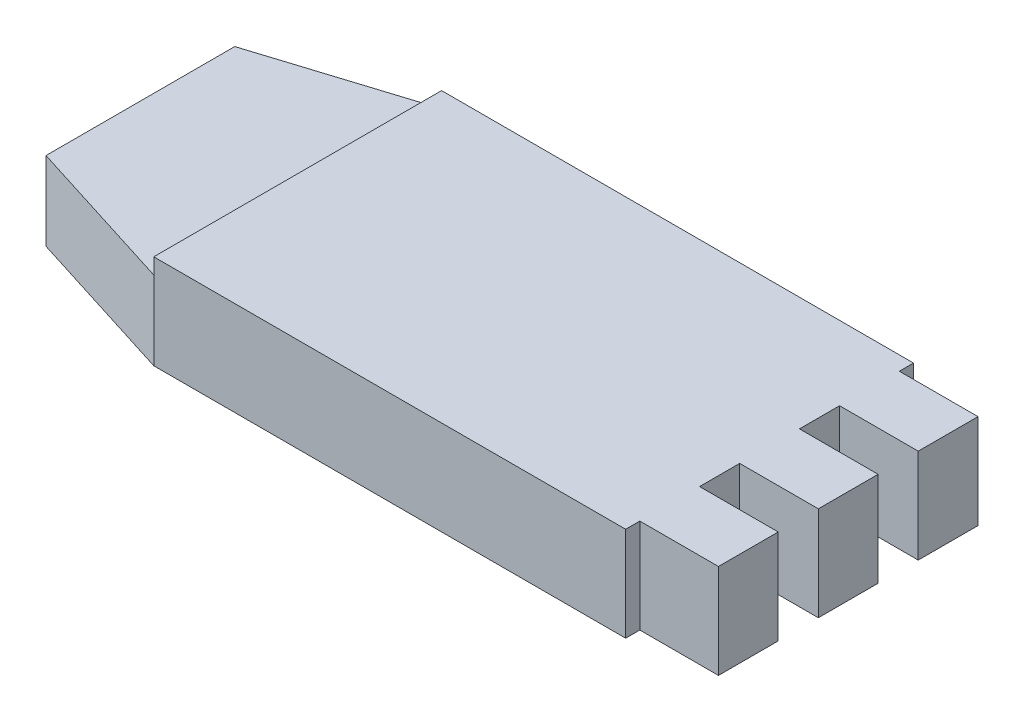
ISO-10303-21;
HEADER;
FILE_DESCRIPTION(('STEP AP214'),'2;1');
FILE_NAME('part.step','',(''),(''),'','','');
FILE_SCHEMA(('AUTOMOTIVE_DESIGN { 1 0 10303 214 1 1 1 1 }'));
ENDSEC;
DATA;
#1=APPLICATION_CONTEXT('core data for automotive mechanical design processes');
#2=APPLICATION_PROTOCOL_DEFINITION('international standard','automotive_design',2000,#1);
#3=PRODUCT_CONTEXT('',#1,'mechanical');
#4=PRODUCT('Part','Part','',(#3));
#5=PRODUCT_RELATED_PRODUCT_CATEGORY('part','',(#4));
#6=PRODUCT_DEFINITION_FORMATION('','',#4);
#7=PRODUCT_DEFINITION_CONTEXT('part definition',#1,'design');
#8=PRODUCT_DEFINITION('design','',#6,#7);
#9=PRODUCT_DEFINITION_SHAPE('','',#8);
#10=(LENGTH_UNIT() NAMED_UNIT(*) SI_UNIT(.MILLI.,.METRE.));
#11=(NAMED_UNIT(*) PLANE_ANGLE_UNIT() SI_UNIT($,.RADIAN.));
#12=(NAMED_UNIT(*) SI_UNIT($,.STERADIAN.) SOLID_ANGLE_UNIT());
#13=UNCERTAINTY_MEASURE_WITH_UNIT(LENGTH_MEASURE(1.E-05),#10,'distance_accuracy_value','');
#14=(GEOMETRIC_REPRESENTATION_CONTEXT(3) GLOBAL_UNCERTAINTY_ASSIGNED_CONTEXT((#13)) GLOBAL_UNIT_ASSIGNED_CONTEXT((#10,
#11,#12)) REPRESENTATION_CONTEXT('',''));
#15=CARTESIAN_POINT('',(0.,0.,0.));
#16=DIRECTION('',(0.,0.,1.));
#17=DIRECTION('',(1.,0.,0.));
#18=AXIS2_PLACEMENT_3D('',#15,#16,#17);
#19=CARTESIAN_POINT('',(-17.5,6.,0.));
#20=DIRECTION('',(-1.,0.,0.));
#21=DIRECTION('',(0.,0.,1.));
#22=AXIS2_PLACEMENT_3D('',#19,#20,#21);
#23=PLANE('',#22);
#24=DIRECTION('',(0.,-1.,0.));
#25=VECTOR('',#24,1.);
#26=CARTESIAN_POINT('',(-17.5,6.,-9.15));
#27=LINE('',#26,#25);
#28=CARTESIAN_POINT('',(-17.5,6.,-9.15));
#29=VERTEX_POINT('',#28);
#30=CARTESIAN_POINT('',(-17.5,5.,-9.15));
#31=VERTEX_POINT('',#30);
#32=EDGE_CURVE('E278',#29,#31,#27,.T.);
#33=ORIENTED_EDGE('',*,*,#32,.T.);
#34=DIRECTION('',(0.,0.,1.));
#35=VECTOR('',#34,1.);
#36=CARTESIAN_POINT('',(-17.5,5.,0.));
#37=LINE('',#36,#35);
#38=CARTESIAN_POINT('',(-17.5,5.,9.15));
#39=VERTEX_POINT('',#38);
#40=EDGE_CURVE('E666',#31,#39,#37,.T.);
#41=ORIENTED_EDGE('',*,*,#40,.T.);
#42=DIRECTION('',(0.,-1.,0.));
#43=VECTOR('',#42,1.);
#44=CARTESIAN_POINT('',(-17.5,6.,9.15));
#45=LINE('',#44,#43);
#46=CARTESIAN_POINT('',(-17.5,6.,9.15));
#47=VERTEX_POINT('',#46);
#48=EDGE_CURVE('E274',#47,#39,#45,.T.);
#49=ORIENTED_EDGE('',*,*,#48,.F.);
#50=DIRECTION('',(0.,0.,-1.));
#51=VECTOR('',#50,1.);
#52=CARTESIAN_POINT('',(-17.5,6.,0.));
#53=LINE('',#52,#51);
#54=EDGE_CURVE('E326',#47,#29,#53,.T.);
#55=ORIENTED_EDGE('',*,*,#54,.T.);
#56=EDGE_LOOP('',(#33,#41,#49,#55));
#57=FACE_BOUND('',#56,.T.);
#58=ADVANCED_FACE('F47',(#57),#23,.T.);
#59=CARTESIAN_POINT('',(12.5,6.,0.));
#60=DIRECTION('',(1.,0.,0.));
#61=DIRECTION('',(0.,0.,-1.));
#62=AXIS2_PLACEMENT_3D('',#59,#60,#61);
#63=PLANE('',#62);
#64=DIRECTION('',(0.,0.,1.));
#65=VECTOR('',#64,1.);
#66=CARTESIAN_POINT('',(12.5,0.,0.));
#67=LINE('',#66,#65);
#68=CARTESIAN_POINT('',(12.5,0.,-4.45));
#69=VERTEX_POINT('',#68);
#70=CARTESIAN_POINT('',(12.5,0.,-1.9));
#71=VERTEX_POINT('',#70);
#72=EDGE_CURVE('E202',#69,#71,#67,.T.);
#73=ORIENTED_EDGE('',*,*,#72,.F.);
#74=DIRECTION('',(0.,-1.,0.));
#75=VECTOR('',#74,1.);
#76=CARTESIAN_POINT('',(12.5,6.,-4.45));
#77=LINE('',#76,#75);
#78=CARTESIAN_POINT('',(12.5,6.,-4.45));
#79=VERTEX_POINT('',#78);
#80=EDGE_CURVE('E11',#79,#69,#77,.T.);
#81=ORIENTED_EDGE('',*,*,#80,.F.);
#82=DIRECTION('',(0.,0.,1.));
#83=VECTOR('',#82,1.);
#84=CARTESIAN_POINT('',(12.5,6.,0.));
#85=LINE('',#84,#83);
#86=CARTESIAN_POINT('',(12.5,6.,-1.9));
#87=VERTEX_POINT('',#86);
#88=EDGE_CURVE('E251',#79,#87,#85,.T.);
#89=ORIENTED_EDGE('',*,*,#88,.T.);
#90=DIRECTION('',(0.,-1.,0.));
#91=VECTOR('',#90,1.);
#92=CARTESIAN_POINT('',(12.5,6.,-1.9));
#93=LINE('',#92,#91);
#94=EDGE_CURVE('E72',#87,#71,#93,.T.);
#95=ORIENTED_EDGE('',*,*,#94,.T.);
#96=EDGE_LOOP('',(#73,#81,#89,#95));
#97=FACE_BOUND('',#96,.T.);
#98=ADVANCED_FACE('F352',(#97),#63,.T.);
#99=CARTESIAN_POINT('',(0.,6.,-4.45));
#100=DIRECTION('',(0.,0.,-1.));
#101=DIRECTION('',(-1.,0.,0.));
#102=AXIS2_PLACEMENT_3D('',#99,#100,#101);
#103=PLANE('',#102);
#104=DIRECTION('',(1.,0.,0.));
#105=VECTOR('',#104,1.);
#106=CARTESIAN_POINT('',(0.,0.,-4.45));
#107=LINE('',#106,#105);
#108=CARTESIAN_POINT('',(17.5,0.,-4.45));
#109=VERTEX_POINT('',#108);
#110=EDGE_CURVE('E205',#69,#109,#107,.T.);
#111=ORIENTED_EDGE('',*,*,#110,.T.);
#112=DIRECTION('',(0.,-1.,0.));
#113=VECTOR('',#112,1.);
#114=CARTESIAN_POINT('',(17.5,6.,-4.45));
#115=LINE('',#114,#113);
#116=CARTESIAN_POINT('',(17.5,6.,-4.45));
#117=VERTEX_POINT('',#116);
#118=EDGE_CURVE('E56',#117,#109,#115,.T.);
#119=ORIENTED_EDGE('',*,*,#118,.F.);
#120=DIRECTION('',(1.,0.,0.));
#121=VECTOR('',#120,1.);
#122=CARTESIAN_POINT('',(0.,6.,-4.45));
#123=LINE('',#122,#121);
#124=EDGE_CURVE('E319',#79,#117,#123,.T.);
#125=ORIENTED_EDGE('',*,*,#124,.F.);
#126=ORIENTED_EDGE('',*,*,#80,.T.);
#127=EDGE_LOOP('',(#111,#119,#125,#126));
#128=FACE_BOUND('',#127,.T.);
#129=ADVANCED_FACE('F49',(#128),#103,.F.);
#130=CARTESIAN_POINT('',(17.5,6.,0.));
#131=DIRECTION('',(-1.,0.,0.));
#132=DIRECTION('',(0.,0.,1.));
#133=AXIS2_PLACEMENT_3D('',#130,#131,#132);
#134=PLANE('',#133);
#135=DIRECTION('',(0.,0.,-1.));
#136=VECTOR('',#135,1.);
#137=CARTESIAN_POINT('',(17.5,0.,0.));
#138=LINE('',#137,#136);
#139=CARTESIAN_POINT('',(17.5,0.,-8.25));
#140=VERTEX_POINT('',#139);
#141=EDGE_CURVE('E211',#109,#140,#138,.T.);
#142=ORIENTED_EDGE('',*,*,#141,.T.);
#143=DIRECTION('',(0.,-1.,0.));
#144=VECTOR('',#143,1.);
#145=CARTESIAN_POINT('',(17.5,6.,-8.25));
#146=LINE('',#145,#144);
#147=CARTESIAN_POINT('',(17.5,6.,-8.25));
#148=VERTEX_POINT('',#147);
#149=EDGE_CURVE('E288',#148,#140,#146,.T.);
#150=ORIENTED_EDGE('',*,*,#149,.F.);
#151=DIRECTION('',(0.,0.,-1.));
#152=VECTOR('',#151,1.);
#153=CARTESIAN_POINT('',(17.5,6.,0.));
#154=LINE('',#153,#152);
#155=EDGE_CURVE('E298',#117,#148,#154,.T.);
#156=ORIENTED_EDGE('',*,*,#155,.F.);
#157=ORIENTED_EDGE('',*,*,#118,.T.);
#158=EDGE_LOOP('',(#142,#150,#156,#157));
#159=FACE_BOUND('',#158,.T.);
#160=ADVANCED_FACE('F296',(#159),#134,.F.);
#161=CARTESIAN_POINT('',(0.,6.,-8.25));
#162=DIRECTION('',(0.,0.,-1.));
#163=DIRECTION('',(-1.,0.,0.));
#164=AXIS2_PLACEMENT_3D('',#161,#162,#163);
#165=PLANE('',#164);
#166=DIRECTION('',(1.,0.,0.));
#167=VECTOR('',#166,1.);
#168=CARTESIAN_POINT('',(0.,0.,-8.25));
#169=LINE('',#168,#167);
#170=CARTESIAN_POINT('',(12.5,0.,-8.25));
#171=VERTEX_POINT('',#170);
#172=EDGE_CURVE('E215',#171,#140,#169,.T.);
#173=ORIENTED_EDGE('',*,*,#172,.F.);
#174=DIRECTION('',(0.,-1.,0.));
#175=VECTOR('',#174,1.);
#176=CARTESIAN_POINT('',(12.5,6.,-8.25));
#177=LINE('',#176,#175);
#178=CARTESIAN_POINT('',(12.5,6.,-8.25));
#179=VERTEX_POINT('',#178);
#180=EDGE_CURVE('E285',#179,#171,#177,.T.);
#181=ORIENTED_EDGE('',*,*,#180,.F.);
#182=DIRECTION('',(1.,0.,0.));
#183=VECTOR('',#182,1.);
#184=CARTESIAN_POINT('',(0.,6.,-8.25));
#185=LINE('',#184,#183);
#186=EDGE_CURVE('E309',#179,#148,#185,.T.);
#187=ORIENTED_EDGE('',*,*,#186,.T.);
#188=ORIENTED_EDGE('',*,*,#149,.T.);
#189=EDGE_LOOP('',(#173,#181,#187,#188));
#190=FACE_BOUND('',#189,.T.);
#191=ADVANCED_FACE('F306',(#190),#165,.T.);
#192=CARTESIAN_POINT('',(12.4999999999999,6.,0.));
#193=DIRECTION('',(1.,0.,0.));
#194=DIRECTION('',(0.,0.,-1.));
#195=AXIS2_PLACEMENT_3D('',#192,#193,#194);
#196=PLANE('',#195);
#197=DIRECTION('',(0.,0.,1.));
#198=VECTOR('',#197,1.);
#199=CARTESIAN_POINT('',(12.4999999999999,0.,0.));
#200=LINE('',#199,#198);
#201=CARTESIAN_POINT('',(12.5,0.,-9.15));
#202=VERTEX_POINT('',#201);
#203=EDGE_CURVE('E219',#202,#171,#200,.T.);
#204=ORIENTED_EDGE('',*,*,#203,.F.);
#205=DIRECTION('',(0.,-1.,0.));
#206=VECTOR('',#205,1.);
#207=CARTESIAN_POINT('',(12.5,6.,-9.15));
#208=LINE('',#207,#206);
#209=CARTESIAN_POINT('',(12.5,6.,-9.15));
#210=VERTEX_POINT('',#209);
#211=EDGE_CURVE('E282',#210,#202,#208,.T.);
#212=ORIENTED_EDGE('',*,*,#211,.F.);
#213=DIRECTION('',(0.,0.,1.));
#214=VECTOR('',#213,1.);
#215=CARTESIAN_POINT('',(12.4999999999999,6.,0.));
#216=LINE('',#215,#214);
#217=EDGE_CURVE('E313',#210,#179,#216,.T.);
#218=ORIENTED_EDGE('',*,*,#217,.T.);
#219=ORIENTED_EDGE('',*,*,#180,.T.);
#220=EDGE_LOOP('',(#204,#212,#218,#219));
#221=FACE_BOUND('',#220,.T.);
#222=ADVANCED_FACE('F372',(#221),#196,.T.);
#223=CARTESIAN_POINT('',(0.,6.,-9.15));
#224=DIRECTION('',(0.,0.,-1.));
#225=DIRECTION('',(-1.,0.,0.));
#226=AXIS2_PLACEMENT_3D('',#223,#224,#225);
#227=PLANE('',#226);
#228=DIRECTION('',(1.,0.,0.));
#229=VECTOR('',#228,1.);
#230=CARTESIAN_POINT('',(0.,0.,-9.15));
#231=LINE('',#230,#229);
#232=CARTESIAN_POINT('',(-17.5,0.,-9.15));
#233=VERTEX_POINT('',#232);
#234=EDGE_CURVE('E223',#233,#202,#231,.T.);
#235=ORIENTED_EDGE('',*,*,#234,.F.);
#236=DIRECTION('',(0.,-1.,0.));
#237=VECTOR('',#236,1.);
#238=CARTESIAN_POINT('',(-17.5,5.,-9.15));
#239=LINE('',#238,#237);
#240=EDGE_CURVE('E689',#31,#233,#239,.T.);
#241=ORIENTED_EDGE('',*,*,#240,.F.);
#242=ORIENTED_EDGE('',*,*,#32,.F.);
#243=DIRECTION('',(1.,0.,0.));
#244=VECTOR('',#243,1.);
#245=CARTESIAN_POINT('',(0.,6.,-9.15));
#246=LINE('',#245,#244);
#247=EDGE_CURVE('E317',#29,#210,#246,.T.);
#248=ORIENTED_EDGE('',*,*,#247,.T.);
#249=ORIENTED_EDGE('',*,*,#211,.T.);
#250=EDGE_LOOP('',(#235,#241,#242,#248,#249));
#251=FACE_BOUND('',#250,.T.);
#252=ADVANCED_FACE('F369',(#251),#227,.T.);
#253=CARTESIAN_POINT('',(0.,6.,9.15));
#254=DIRECTION('',(0.,0.,-1.));
#255=DIRECTION('',(-1.,0.,0.));
#256=AXIS2_PLACEMENT_3D('',#253,#254,#255);
#257=PLANE('',#256);
#258=DIRECTION('',(1.,0.,0.));
#259=VECTOR('',#258,1.);
#260=CARTESIAN_POINT('',(0.,0.,9.15));
#261=LINE('',#260,#259);
#262=CARTESIAN_POINT('',(-17.5,0.,9.15));
#263=VERTEX_POINT('',#262);
#264=CARTESIAN_POINT('',(12.5,0.,9.15));
#265=VERTEX_POINT('',#264);
#266=EDGE_CURVE('E227',#263,#265,#261,.T.);
#267=ORIENTED_EDGE('',*,*,#266,.T.);
#268=DIRECTION('',(0.,-1.,0.));
#269=VECTOR('',#268,1.);
#270=CARTESIAN_POINT('',(12.5,6.,9.15));
#271=LINE('',#270,#269);
#272=CARTESIAN_POINT('',(12.5,6.,9.15));
#273=VERTEX_POINT('',#272);
#274=EDGE_CURVE('E271',#273,#265,#271,.T.);
#275=ORIENTED_EDGE('',*,*,#274,.F.);
#276=DIRECTION('',(1.,0.,0.));
#277=VECTOR('',#276,1.);
#278=CARTESIAN_POINT('',(0.,6.,9.15));
#279=LINE('',#278,#277);
#280=EDGE_CURVE('E330',#47,#273,#279,.T.);
#281=ORIENTED_EDGE('',*,*,#280,.F.);
#282=ORIENTED_EDGE('',*,*,#48,.T.);
#283=DIRECTION('',(0.,-1.,0.));
#284=VECTOR('',#283,1.);
#285=CARTESIAN_POINT('',(-17.5,5.,9.15));
#286=LINE('',#285,#284);
#287=EDGE_CURVE('E63',#39,#263,#286,.T.);
#288=ORIENTED_EDGE('',*,*,#287,.T.);
#289=EDGE_LOOP('',(#267,#275,#281,#282,#288));
#290=FACE_BOUND('',#289,.T.);
#291=ADVANCED_FACE('F367',(#290),#257,.F.);
#292=CARTESIAN_POINT('',(12.5,0.,8.25));
#293=VERTEX_POINT('',#292);
#294=EDGE_CURVE('E208',#293,#265,#67,.T.);
#295=ORIENTED_EDGE('',*,*,#294,.F.);
#296=DIRECTION('',(0.,-1.,0.));
#297=VECTOR('',#296,1.);
#298=CARTESIAN_POINT('',(12.5,6.,8.25));
#299=LINE('',#298,#297);
#300=CARTESIAN_POINT('',(12.5,6.,8.25));
#301=VERTEX_POINT('',#300);
#302=EDGE_CURVE('E268',#301,#293,#299,.T.);
#303=ORIENTED_EDGE('',*,*,#302,.F.);
#304=EDGE_CURVE('E333',#301,#273,#85,.T.);
#305=ORIENTED_EDGE('',*,*,#304,.T.);
#306=ORIENTED_EDGE('',*,*,#274,.T.);
#307=EDGE_LOOP('',(#295,#303,#305,#306));
#308=FACE_BOUND('',#307,.T.);
#309=ADVANCED_FACE('F358',(#308),#63,.T.);
#310=CARTESIAN_POINT('',(0.,6.,8.25));
#311=DIRECTION('',(0.,0.,-1.));
#312=DIRECTION('',(-1.,0.,0.));
#313=AXIS2_PLACEMENT_3D('',#310,#311,#312);
#314=PLANE('',#313);
#315=DIRECTION('',(1.,0.,0.));
#316=VECTOR('',#315,1.);
#317=CARTESIAN_POINT('',(0.,0.,8.25));
#318=LINE('',#317,#316);
#319=CARTESIAN_POINT('',(17.5,0.,8.25));
#320=VERTEX_POINT('',#319);
#321=EDGE_CURVE('E231',#293,#320,#318,.T.);
#322=ORIENTED_EDGE('',*,*,#321,.T.);
#323=DIRECTION('',(0.,-1.,0.));
#324=VECTOR('',#323,1.);
#325=CARTESIAN_POINT('',(17.5,6.,8.25));
#326=LINE('',#325,#324);
#327=CARTESIAN_POINT('',(17.5,6.,8.25));
#328=VERTEX_POINT('',#327);
#329=EDGE_CURVE('E264',#328,#320,#326,.T.);
#330=ORIENTED_EDGE('',*,*,#329,.F.);
#331=DIRECTION('',(1.,0.,0.));
#332=VECTOR('',#331,1.);
#333=CARTESIAN_POINT('',(0.,6.,8.25));
#334=LINE('',#333,#332);
#335=EDGE_CURVE('E334',#301,#328,#334,.T.);
#336=ORIENTED_EDGE('',*,*,#335,.F.);
#337=ORIENTED_EDGE('',*,*,#302,.T.);
#338=EDGE_LOOP('',(#322,#330,#336,#337));
#339=FACE_BOUND('',#338,.T.);
#340=ADVANCED_FACE('F402',(#339),#314,.F.);
#341=CARTESIAN_POINT('',(17.5,6.,0.));
#342=DIRECTION('',(-1.,0.,0.));
#343=DIRECTION('',(0.,0.,1.));
#344=AXIS2_PLACEMENT_3D('',#341,#342,#343);
#345=PLANE('',#344);
#346=DIRECTION('',(0.,0.,-1.));
#347=VECTOR('',#346,1.);
#348=CARTESIAN_POINT('',(17.5,0.,0.));
#349=LINE('',#348,#347);
#350=CARTESIAN_POINT('',(17.5,0.,4.44999999999999));
#351=VERTEX_POINT('',#350);
#352=EDGE_CURVE('E234',#320,#351,#349,.T.);
#353=ORIENTED_EDGE('',*,*,#352,.T.);
#354=DIRECTION('',(0.,-1.,0.));
#355=VECTOR('',#354,1.);
#356=CARTESIAN_POINT('',(17.5,6.,4.44999999999999));
#357=LINE('',#356,#355);
#358=CARTESIAN_POINT('',(17.5,6.,4.44999999999999));
#359=VERTEX_POINT('',#358);
#360=EDGE_CURVE('E261',#359,#351,#357,.T.);
#361=ORIENTED_EDGE('',*,*,#360,.F.);
#362=DIRECTION('',(0.,0.,-1.));
#363=VECTOR('',#362,1.);
#364=CARTESIAN_POINT('',(17.5,6.,0.));
#365=LINE('',#364,#363);
#366=EDGE_CURVE('E337',#328,#359,#365,.T.);
#367=ORIENTED_EDGE('',*,*,#366,.F.);
#368=ORIENTED_EDGE('',*,*,#329,.T.);
#369=EDGE_LOOP('',(#353,#361,#367,#368));
#370=FACE_BOUND('',#369,.T.);
#371=ADVANCED_FACE('F409',(#370),#345,.F.);
#372=CARTESIAN_POINT('',(0.,6.,4.45));
#373=DIRECTION('',(0.,0.,-1.));
#374=DIRECTION('',(-1.,0.,0.));
#375=AXIS2_PLACEMENT_3D('',#372,#373,#374);
#376=PLANE('',#375);
#377=DIRECTION('',(1.,0.,0.));
#378=VECTOR('',#377,1.);
#379=CARTESIAN_POINT('',(0.,0.,4.45));
#380=LINE('',#379,#378);
#381=CARTESIAN_POINT('',(12.5,0.,4.44999999999999));
#382=VERTEX_POINT('',#381);
#383=EDGE_CURVE('E238',#382,#351,#380,.T.);
#384=ORIENTED_EDGE('',*,*,#383,.F.);
#385=DIRECTION('',(0.,-1.,0.));
#386=VECTOR('',#385,1.);
#387=CARTESIAN_POINT('',(12.5,6.,4.44999999999999));
#388=LINE('',#387,#386);
#389=CARTESIAN_POINT('',(12.5,6.,4.44999999999999));
#390=VERTEX_POINT('',#389);
#391=EDGE_CURVE('E258',#390,#382,#388,.T.);
#392=ORIENTED_EDGE('',*,*,#391,.F.);
#393=DIRECTION('',(1.,0.,0.));
#394=VECTOR('',#393,1.);
#395=CARTESIAN_POINT('',(0.,6.,4.45));
#396=LINE('',#395,#394);
#397=EDGE_CURVE('E339',#390,#359,#396,.T.);
#398=ORIENTED_EDGE('',*,*,#397,.T.);
#399=ORIENTED_EDGE('',*,*,#360,.T.);
#400=EDGE_LOOP('',(#384,#392,#398,#399));
#401=FACE_BOUND('',#400,.T.);
#402=ADVANCED_FACE('F416',(#401),#376,.T.);
#403=CARTESIAN_POINT('',(12.5,0.,1.9));
#404=VERTEX_POINT('',#403);
#405=EDGE_CURVE('E207',#404,#382,#67,.T.);
#406=ORIENTED_EDGE('',*,*,#405,.F.);
#407=DIRECTION('',(0.,-1.,0.));
#408=VECTOR('',#407,1.);
#409=CARTESIAN_POINT('',(12.5,6.,1.9));
#410=LINE('',#409,#408);
#411=CARTESIAN_POINT('',(12.5,6.,1.9));
#412=VERTEX_POINT('',#411);
#413=EDGE_CURVE('E191',#412,#404,#410,.T.);
#414=ORIENTED_EDGE('',*,*,#413,.F.);
#415=EDGE_CURVE('E178',#412,#390,#85,.T.);
#416=ORIENTED_EDGE('',*,*,#415,.T.);
#417=ORIENTED_EDGE('',*,*,#391,.T.);
#418=EDGE_LOOP('',(#406,#414,#416,#417));
#419=FACE_BOUND('',#418,.T.);
#420=ADVANCED_FACE('F359',(#419),#63,.T.);
#421=CARTESIAN_POINT('',(0.,6.,1.9));
#422=DIRECTION('',(0.,0.,-1.));
#423=DIRECTION('',(-1.,0.,0.));
#424=AXIS2_PLACEMENT_3D('',#421,#422,#423);
#425=PLANE('',#424);
#426=DIRECTION('',(1.,0.,0.));
#427=VECTOR('',#426,1.);
#428=CARTESIAN_POINT('',(0.,0.,1.9));
#429=LINE('',#428,#427);
#430=CARTESIAN_POINT('',(17.5,0.,1.9));
#431=VERTEX_POINT('',#430);
#432=EDGE_CURVE('E186',#404,#431,#429,.T.);
#433=ORIENTED_EDGE('',*,*,#432,.T.);
#434=DIRECTION('',(0.,-1.,0.));
#435=VECTOR('',#434,1.);
#436=CARTESIAN_POINT('',(17.5,6.,1.9));
#437=LINE('',#436,#435);
#438=CARTESIAN_POINT('',(17.5,6.,1.9));
#439=VERTEX_POINT('',#438);
#440=EDGE_CURVE('E183',#439,#431,#437,.T.);
#441=ORIENTED_EDGE('',*,*,#440,.F.);
#442=DIRECTION('',(1.,0.,0.));
#443=VECTOR('',#442,1.);
#444=CARTESIAN_POINT('',(0.,6.,1.9));
#445=LINE('',#444,#443);
#446=EDGE_CURVE('E168',#412,#439,#445,.T.);
#447=ORIENTED_EDGE('',*,*,#446,.F.);
#448=ORIENTED_EDGE('',*,*,#413,.T.);
#449=EDGE_LOOP('',(#433,#441,#447,#448));
#450=FACE_BOUND('',#449,.T.);
#451=ADVANCED_FACE('F184',(#450),#425,.F.);
#452=CARTESIAN_POINT('',(17.5,6.,0.));
#453=DIRECTION('',(-1.,0.,0.));
#454=DIRECTION('',(0.,0.,1.));
#455=AXIS2_PLACEMENT_3D('',#452,#453,#454);
#456=PLANE('',#455);
#457=DIRECTION('',(0.,0.,-1.));
#458=VECTOR('',#457,1.);
#459=CARTESIAN_POINT('',(17.5,0.,0.));
#460=LINE('',#459,#458);
#461=CARTESIAN_POINT('',(17.5,0.,-1.9));
#462=VERTEX_POINT('',#461);
#463=EDGE_CURVE('E244',#431,#462,#460,.T.);
#464=ORIENTED_EDGE('',*,*,#463,.T.);
#465=DIRECTION('',(0.,-1.,0.));
#466=VECTOR('',#465,1.);
#467=CARTESIAN_POINT('',(17.5,6.,-1.9));
#468=LINE('',#467,#466);
#469=CARTESIAN_POINT('',(17.5,6.,-1.9));
#470=VERTEX_POINT('',#469);
#471=EDGE_CURVE('E192',#470,#462,#468,.T.);
#472=ORIENTED_EDGE('',*,*,#471,.F.);
#473=DIRECTION('',(0.,0.,-1.));
#474=VECTOR('',#473,1.);
#475=CARTESIAN_POINT('',(17.5,6.,0.));
#476=LINE('',#475,#474);
#477=EDGE_CURVE('E174',#439,#470,#476,.T.);
#478=ORIENTED_EDGE('',*,*,#477,.F.);
#479=ORIENTED_EDGE('',*,*,#440,.T.);
#480=EDGE_LOOP('',(#464,#472,#478,#479));
#481=FACE_BOUND('',#480,.T.);
#482=ADVANCED_FACE('F194',(#481),#456,.F.);
#483=CARTESIAN_POINT('',(0.,6.,-1.9));
#484=DIRECTION('',(0.,0.,-1.));
#485=DIRECTION('',(-1.,0.,0.));
#486=AXIS2_PLACEMENT_3D('',#483,#484,#485);
#487=PLANE('',#486);
#488=DIRECTION('',(1.,0.,0.));
#489=VECTOR('',#488,1.);
#490=CARTESIAN_POINT('',(0.,0.,-1.9));
#491=LINE('',#490,#489);
#492=EDGE_CURVE('E247',#71,#462,#491,.T.);
#493=ORIENTED_EDGE('',*,*,#492,.F.);
#494=ORIENTED_EDGE('',*,*,#94,.F.);
#495=DIRECTION('',(1.,0.,0.));
#496=VECTOR('',#495,1.);
#497=CARTESIAN_POINT('',(0.,6.,-1.9));
#498=LINE('',#497,#496);
#499=EDGE_CURVE('E196',#87,#470,#498,.T.);
#500=ORIENTED_EDGE('',*,*,#499,.T.);
#501=ORIENTED_EDGE('',*,*,#471,.T.);
#502=EDGE_LOOP('',(#493,#494,#500,#501));
#503=FACE_BOUND('',#502,.T.);
#504=ADVANCED_FACE('F441',(#503),#487,.T.);
#505=CARTESIAN_POINT('',(0.,6.,0.));
#506=DIRECTION('',(0.,1.,0.));
#507=DIRECTION('',(0.,0.,1.));
#508=AXIS2_PLACEMENT_3D('',#505,#506,#507);
#509=PLANE('',#508);
#510=ORIENTED_EDGE('',*,*,#88,.F.);
#511=ORIENTED_EDGE('',*,*,#124,.T.);
#512=ORIENTED_EDGE('',*,*,#155,.T.);
#513=ORIENTED_EDGE('',*,*,#186,.F.);
#514=ORIENTED_EDGE('',*,*,#217,.F.);
#515=ORIENTED_EDGE('',*,*,#247,.F.);
#516=ORIENTED_EDGE('',*,*,#54,.F.);
#517=ORIENTED_EDGE('',*,*,#280,.T.);
#518=ORIENTED_EDGE('',*,*,#304,.F.);
#519=ORIENTED_EDGE('',*,*,#335,.T.);
#520=ORIENTED_EDGE('',*,*,#366,.T.);
#521=ORIENTED_EDGE('',*,*,#397,.F.);
#522=ORIENTED_EDGE('',*,*,#415,.F.);
#523=ORIENTED_EDGE('',*,*,#446,.T.);
#524=ORIENTED_EDGE('',*,*,#477,.T.);
#525=ORIENTED_EDGE('',*,*,#499,.F.);
#526=EDGE_LOOP('',(#510,#511,#512,#513,#514,#515,#516,#517,#518,#519,#520,#521,#522,#523,#524,#525));
#527=FACE_BOUND('',#526,.T.);
#528=ADVANCED_FACE('F171',(#527),#509,.T.);
#529=CARTESIAN_POINT('',(0.,0.,0.));
#530=DIRECTION('',(0.,1.,0.));
#531=DIRECTION('',(0.,0.,1.));
#532=AXIS2_PLACEMENT_3D('',#529,#530,#531);
#533=PLANE('',#532);
#534=ORIENTED_EDGE('',*,*,#72,.T.);
#535=ORIENTED_EDGE('',*,*,#492,.T.);
#536=ORIENTED_EDGE('',*,*,#463,.F.);
#537=ORIENTED_EDGE('',*,*,#432,.F.);
#538=ORIENTED_EDGE('',*,*,#405,.T.);
#539=ORIENTED_EDGE('',*,*,#383,.T.);
#540=ORIENTED_EDGE('',*,*,#352,.F.);
#541=ORIENTED_EDGE('',*,*,#321,.F.);
#542=ORIENTED_EDGE('',*,*,#294,.T.);
#543=ORIENTED_EDGE('',*,*,#266,.F.);
#544=DIRECTION('',(0.953798645697972,0.,0.300446573394861));
#545=VECTOR('',#544,1.);
#546=CARTESIAN_POINT('',(-4.20176715413132,0.,13.3389433464486));
#547=LINE('',#546,#545);
#548=CARTESIAN_POINT('',(-27.5,0.,6.));
#549=VERTEX_POINT('',#548);
#550=EDGE_CURVE('E672',#549,#263,#547,.T.);
#551=ORIENTED_EDGE('',*,*,#550,.F.);
#552=DIRECTION('',(0.,0.,-1.));
#553=VECTOR('',#552,1.);
#554=CARTESIAN_POINT('',(-27.5,0.,0.));
#555=LINE('',#554,#553);
#556=CARTESIAN_POINT('',(-27.5,0.,-6.));
#557=VERTEX_POINT('',#556);
#558=EDGE_CURVE('E694',#549,#557,#555,.T.);
#559=ORIENTED_EDGE('',*,*,#558,.T.);
#560=DIRECTION('',(0.953798645697972,0.,-0.300446573394861));
#561=VECTOR('',#560,1.);
#562=CARTESIAN_POINT('',(-4.20176715413132,0.,-13.3389433464486));
#563=LINE('',#562,#561);
#564=EDGE_CURVE('E690',#557,#233,#563,.T.);
#565=ORIENTED_EDGE('',*,*,#564,.T.);
#566=ORIENTED_EDGE('',*,*,#234,.T.);
#567=ORIENTED_EDGE('',*,*,#203,.T.);
#568=ORIENTED_EDGE('',*,*,#172,.T.);
#569=ORIENTED_EDGE('',*,*,#141,.F.);
#570=ORIENTED_EDGE('',*,*,#110,.F.);
#571=EDGE_LOOP('',(#534,#535,#536,#537,#538,#539,#540,#541,#542,#543,#551,#559,#565,#566,#567,
#568,#569,#570));
#572=FACE_BOUND('',#571,.T.);
#573=ADVANCED_FACE('F302',(#572),#533,.F.);
#574=CARTESIAN_POINT('',(-4.20176715413132,5.,-13.3389433464486));
#575=DIRECTION('',(-0.300446573394861,0.,-0.953798645697972));
#576=DIRECTION('',(-0.953798645697972,0.,0.300446573394861));
#577=AXIS2_PLACEMENT_3D('',#574,#575,#576);
#578=PLANE('',#577);
#579=ORIENTED_EDGE('',*,*,#564,.F.);
#580=DIRECTION('',(0.,-1.,0.));
#581=VECTOR('',#580,1.);
#582=CARTESIAN_POINT('',(-27.5,5.,-6.));
#583=LINE('',#582,#581);
#584=CARTESIAN_POINT('',(-27.5,5.,-6.));
#585=VERTEX_POINT('',#584);
#586=EDGE_CURVE('E206',#585,#557,#583,.T.);
#587=ORIENTED_EDGE('',*,*,#586,.F.);
#588=DIRECTION('',(0.953798645697972,0.,-0.300446573394861));
#589=VECTOR('',#588,1.);
#590=CARTESIAN_POINT('',(-4.20176715413132,5.,-13.3389433464486));
#591=LINE('',#590,#589);
#592=EDGE_CURVE('E661',#585,#31,#591,.T.);
#593=ORIENTED_EDGE('',*,*,#592,.T.);
#594=ORIENTED_EDGE('',*,*,#240,.T.);
#595=EDGE_LOOP('',(#579,#587,#593,#594));
#596=FACE_BOUND('',#595,.T.);
#597=ADVANCED_FACE('F460',(#596),#578,.T.);
#598=CARTESIAN_POINT('',(-27.5,5.,0.));
#599=DIRECTION('',(-1.,0.,0.));
#600=DIRECTION('',(0.,0.,1.));
#601=AXIS2_PLACEMENT_3D('',#598,#599,#600);
#602=PLANE('',#601);
#603=ORIENTED_EDGE('',*,*,#558,.F.);
#604=DIRECTION('',(0.,-1.,0.));
#605=VECTOR('',#604,1.);
#606=CARTESIAN_POINT('',(-27.5,5.,6.));
#607=LINE('',#606,#605);
#608=CARTESIAN_POINT('',(-27.5,5.,6.));
#609=VERTEX_POINT('',#608);
#610=EDGE_CURVE('E680',#609,#549,#607,.T.);
#611=ORIENTED_EDGE('',*,*,#610,.F.);
#612=DIRECTION('',(0.,0.,-1.));
#613=VECTOR('',#612,1.);
#614=CARTESIAN_POINT('',(-27.5,5.,0.));
#615=LINE('',#614,#613);
#616=EDGE_CURVE('E664',#609,#585,#615,.T.);
#617=ORIENTED_EDGE('',*,*,#616,.T.);
#618=ORIENTED_EDGE('',*,*,#586,.T.);
#619=EDGE_LOOP('',(#603,#611,#617,#618));
#620=FACE_BOUND('',#619,.T.);
#621=ADVANCED_FACE('F467',(#620),#602,.T.);
#622=CARTESIAN_POINT('',(-4.20176715413132,5.,13.3389433464486));
#623=DIRECTION('',(0.300446573394861,0.,-0.953798645697972));
#624=DIRECTION('',(-0.953798645697972,0.,-0.300446573394861));
#625=AXIS2_PLACEMENT_3D('',#622,#623,#624);
#626=PLANE('',#625);
#627=ORIENTED_EDGE('',*,*,#550,.T.);
#628=ORIENTED_EDGE('',*,*,#287,.F.);
#629=DIRECTION('',(0.953798645697972,0.,0.300446573394861));
#630=VECTOR('',#629,1.);
#631=CARTESIAN_POINT('',(-4.20176715413132,5.,13.3389433464486));
#632=LINE('',#631,#630);
#633=EDGE_CURVE('E682',#609,#39,#632,.T.);
#634=ORIENTED_EDGE('',*,*,#633,.F.);
#635=ORIENTED_EDGE('',*,*,#610,.T.);
#636=EDGE_LOOP('',(#627,#628,#634,#635));
#637=FACE_BOUND('',#636,.T.);
#638=ADVANCED_FACE('F475',(#637),#626,.F.);
#639=CARTESIAN_POINT('',(0.,5.,0.));
#640=DIRECTION('',(0.,1.,0.));
#641=DIRECTION('',(0.,0.,1.));
#642=AXIS2_PLACEMENT_3D('',#639,#640,#641);
#643=PLANE('',#642);
#644=ORIENTED_EDGE('',*,*,#592,.F.);
#645=ORIENTED_EDGE('',*,*,#616,.F.);
#646=ORIENTED_EDGE('',*,*,#633,.T.);
#647=ORIENTED_EDGE('',*,*,#40,.F.);
#648=EDGE_LOOP('',(#644,#645,#646,#647));
#649=FACE_BOUND('',#648,.T.);
#650=ADVANCED_FACE('F483',(#649),#643,.T.);
#651=CLOSED_SHELL('',(#58,#98,#129,#160,#191,#222,#252,#291,#309,#340,#371,#402,#420,#451,#482,
#504,#528,#573,#597,#621,#638,#650));
#652=MANIFOLD_SOLID_BREP('B2',#651);
#653=ADVANCED_BREP_SHAPE_REPRESENTATION('',(#18,#652),#14);
#654=SHAPE_DEFINITION_REPRESENTATION(#9,#653);
ENDSEC;
END-ISO-10303-21;
